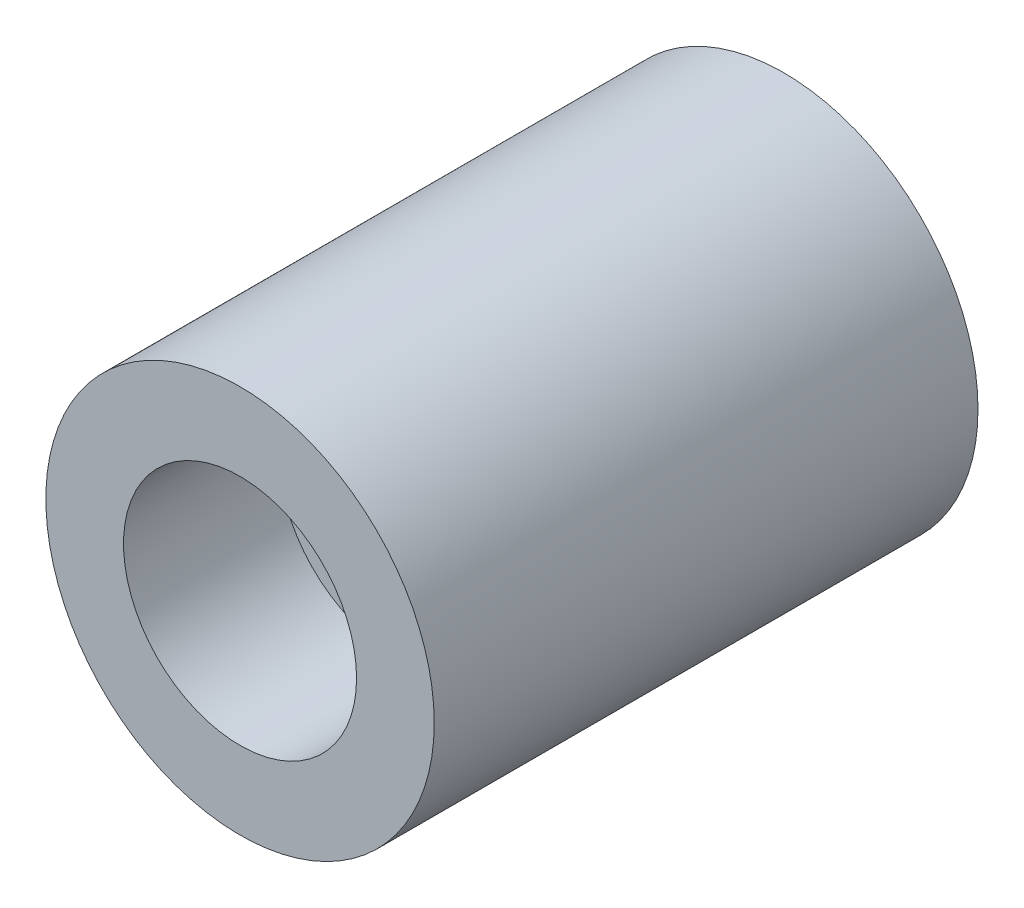
ISO-10303-21;
HEADER;
FILE_DESCRIPTION(('STEP AP214'),'2;1');
FILE_NAME('part.step','',(''),(''),'','','');
FILE_SCHEMA(('AUTOMOTIVE_DESIGN { 1 0 10303 214 1 1 1 1 }'));
ENDSEC;
DATA;
#1=APPLICATION_CONTEXT('core data for automotive mechanical design processes');
#2=APPLICATION_PROTOCOL_DEFINITION('international standard','automotive_design',2000,#1);
#3=PRODUCT_CONTEXT('',#1,'mechanical');
#4=PRODUCT('Part','Part','',(#3));
#5=PRODUCT_RELATED_PRODUCT_CATEGORY('part','',(#4));
#6=PRODUCT_DEFINITION_FORMATION('','',#4);
#7=PRODUCT_DEFINITION_CONTEXT('part definition',#1,'design');
#8=PRODUCT_DEFINITION('design','',#6,#7);
#9=PRODUCT_DEFINITION_SHAPE('','',#8);
#10=(LENGTH_UNIT() NAMED_UNIT(*) SI_UNIT(.MILLI.,.METRE.));
#11=(NAMED_UNIT(*) PLANE_ANGLE_UNIT() SI_UNIT($,.RADIAN.));
#12=(NAMED_UNIT(*) SI_UNIT($,.STERADIAN.) SOLID_ANGLE_UNIT());
#13=UNCERTAINTY_MEASURE_WITH_UNIT(LENGTH_MEASURE(1.E-05),#10,'distance_accuracy_value','');
#14=(GEOMETRIC_REPRESENTATION_CONTEXT(3) GLOBAL_UNCERTAINTY_ASSIGNED_CONTEXT((#13)) GLOBAL_UNIT_ASSIGNED_CONTEXT((#10,
#11,#12)) REPRESENTATION_CONTEXT('',''));
#15=CARTESIAN_POINT('',(0.,0.,0.));
#16=DIRECTION('',(0.,0.,1.));
#17=DIRECTION('',(1.,0.,0.));
#18=AXIS2_PLACEMENT_3D('',#15,#16,#17);
#19=CARTESIAN_POINT('',(0.,0.,3556.));
#20=DIRECTION('',(0.,0.,-1.));
#21=DIRECTION('',(-1.,0.,0.));
#22=AXIS2_PLACEMENT_3D('',#19,#20,#21);
#23=CYLINDRICAL_SURFACE('',#22,1270.);
#24=CARTESIAN_POINT('',(0.,0.,3556.));
#25=DIRECTION('',(0.,0.,1.));
#26=DIRECTION('',(1.,0.,0.));
#27=AXIS2_PLACEMENT_3D('',#24,#25,#26);
#28=CIRCLE('',#27,1270.);
#29=CARTESIAN_POINT('',(1270.,0.,3556.));
#30=VERTEX_POINT('',#29);
#31=EDGE_CURVE('E10',#30,#30,#28,.T.);
#32=ORIENTED_EDGE('',*,*,#31,.F.);
#33=EDGE_LOOP('',(#32));
#34=FACE_BOUND('',#33,.T.);
#35=CARTESIAN_POINT('',(0.,0.,0.));
#36=DIRECTION('',(0.,0.,1.));
#37=DIRECTION('',(1.,0.,0.));
#38=AXIS2_PLACEMENT_3D('',#35,#36,#37);
#39=CIRCLE('',#38,1270.);
#40=CARTESIAN_POINT('',(1270.,0.,0.));
#41=VERTEX_POINT('',#40);
#42=EDGE_CURVE('E34',#41,#41,#39,.T.);
#43=ORIENTED_EDGE('',*,*,#42,.T.);
#44=EDGE_LOOP('',(#43));
#45=FACE_BOUND('',#44,.T.);
#46=ADVANCED_FACE('F31',(#34,#45),#23,.T.);
#47=CARTESIAN_POINT('',(0.,0.,3556.));
#48=DIRECTION('',(0.,0.,1.));
#49=DIRECTION('',(1.,0.,0.));
#50=AXIS2_PLACEMENT_3D('',#47,#48,#49);
#51=PLANE('',#50);
#52=CARTESIAN_POINT('',(0.,0.,3556.));
#53=DIRECTION('',(0.,0.,1.));
#54=DIRECTION('',(1.,0.,0.));
#55=AXIS2_PLACEMENT_3D('',#52,#53,#54);
#56=CIRCLE('',#55,762.);
#57=CARTESIAN_POINT('',(762.,0.,3556.));
#58=VERTEX_POINT('',#57);
#59=EDGE_CURVE('E43',#58,#58,#56,.T.);
#60=ORIENTED_EDGE('',*,*,#59,.F.);
#61=EDGE_LOOP('',(#60));
#62=FACE_BOUND('',#61,.T.);
#63=ORIENTED_EDGE('',*,*,#31,.T.);
#64=EDGE_LOOP('',(#63));
#65=FACE_BOUND('',#64,.T.);
#66=ADVANCED_FACE('F76',(#62,#65),#51,.T.);
#67=CARTESIAN_POINT('',(0.,0.,0.));
#68=DIRECTION('',(0.,0.,1.));
#69=DIRECTION('',(1.,0.,0.));
#70=AXIS2_PLACEMENT_3D('',#67,#68,#69);
#71=PLANE('',#70);
#72=ORIENTED_EDGE('',*,*,#42,.F.);
#73=EDGE_LOOP('',(#72));
#74=FACE_BOUND('',#73,.T.);
#75=ADVANCED_FACE('F72',(#74),#71,.F.);
#76=CARTESIAN_POINT('',(0.,0.,2540.));
#77=DIRECTION('',(0.,0.,1.));
#78=DIRECTION('',(1.,0.,0.));
#79=AXIS2_PLACEMENT_3D('',#76,#77,#78);
#80=CYLINDRICAL_SURFACE('',#79,762.);
#81=CARTESIAN_POINT('',(0.,0.,2540.));
#82=DIRECTION('',(0.,0.,1.));
#83=DIRECTION('',(1.,0.,0.));
#84=AXIS2_PLACEMENT_3D('',#81,#82,#83);
#85=CIRCLE('',#84,762.);
#86=CARTESIAN_POINT('',(762.,0.,2540.));
#87=VERTEX_POINT('',#86);
#88=EDGE_CURVE('E41',#87,#87,#85,.T.);
#89=ORIENTED_EDGE('',*,*,#88,.F.);
#90=EDGE_LOOP('',(#89));
#91=FACE_BOUND('',#90,.T.);
#92=ORIENTED_EDGE('',*,*,#59,.T.);
#93=EDGE_LOOP('',(#92));
#94=FACE_BOUND('',#93,.T.);
#95=ADVANCED_FACE('F66',(#91,#94),#80,.F.);
#96=CARTESIAN_POINT('',(0.,0.,2540.));
#97=DIRECTION('',(0.,0.,1.));
#98=DIRECTION('',(1.,0.,0.));
#99=AXIS2_PLACEMENT_3D('',#96,#97,#98);
#100=PLANE('',#99);
#101=CARTESIAN_POINT('',(0.,0.,2540.));
#102=DIRECTION('',(0.,0.,1.));
#103=DIRECTION('',(1.,0.,0.));
#104=AXIS2_PLACEMENT_3D('',#101,#102,#103);
#105=CIRCLE('',#104,254.);
#106=CARTESIAN_POINT('',(254.,0.,2540.));
#107=VERTEX_POINT('',#106);
#108=EDGE_CURVE('E49',#107,#107,#105,.T.);
#109=ORIENTED_EDGE('',*,*,#108,.F.);
#110=EDGE_LOOP('',(#109));
#111=FACE_BOUND('',#110,.T.);
#112=ORIENTED_EDGE('',*,*,#88,.T.);
#113=EDGE_LOOP('',(#112));
#114=FACE_BOUND('',#113,.T.);
#115=ADVANCED_FACE('F60',(#111,#114),#100,.T.);
#116=CARTESIAN_POINT('',(0.,0.,508.));
#117=DIRECTION('',(0.,0.,1.));
#118=DIRECTION('',(1.,0.,0.));
#119=AXIS2_PLACEMENT_3D('',#116,#117,#118);
#120=CYLINDRICAL_SURFACE('',#119,254.);
#121=CARTESIAN_POINT('',(0.,0.,508.));
#122=DIRECTION('',(0.,0.,1.));
#123=DIRECTION('',(1.,0.,0.));
#124=AXIS2_PLACEMENT_3D('',#121,#122,#123);
#125=CIRCLE('',#124,254.);
#126=CARTESIAN_POINT('',(254.,0.,508.));
#127=VERTEX_POINT('',#126);
#128=EDGE_CURVE('E46',#127,#127,#125,.T.);
#129=ORIENTED_EDGE('',*,*,#128,.F.);
#130=EDGE_LOOP('',(#129));
#131=FACE_BOUND('',#130,.T.);
#132=ORIENTED_EDGE('',*,*,#108,.T.);
#133=EDGE_LOOP('',(#132));
#134=FACE_BOUND('',#133,.T.);
#135=ADVANCED_FACE('F57',(#131,#134),#120,.F.);
#136=CARTESIAN_POINT('',(0.,0.,508.));
#137=DIRECTION('',(0.,0.,1.));
#138=DIRECTION('',(1.,0.,0.));
#139=AXIS2_PLACEMENT_3D('',#136,#137,#138);
#140=PLANE('',#139);
#141=ORIENTED_EDGE('',*,*,#128,.T.);
#142=EDGE_LOOP('',(#141));
#143=FACE_BOUND('',#142,.T.);
#144=ADVANCED_FACE('F55',(#143),#140,.T.);
#145=CLOSED_SHELL('',(#46,#66,#75,#95,#115,#135,#144));
#146=MANIFOLD_SOLID_BREP('B2',#145);
#147=ADVANCED_BREP_SHAPE_REPRESENTATION('',(#18,#146),#14);
#148=SHAPE_DEFINITION_REPRESENTATION(#9,#147);
ENDSEC;
END-ISO-10303-21;
